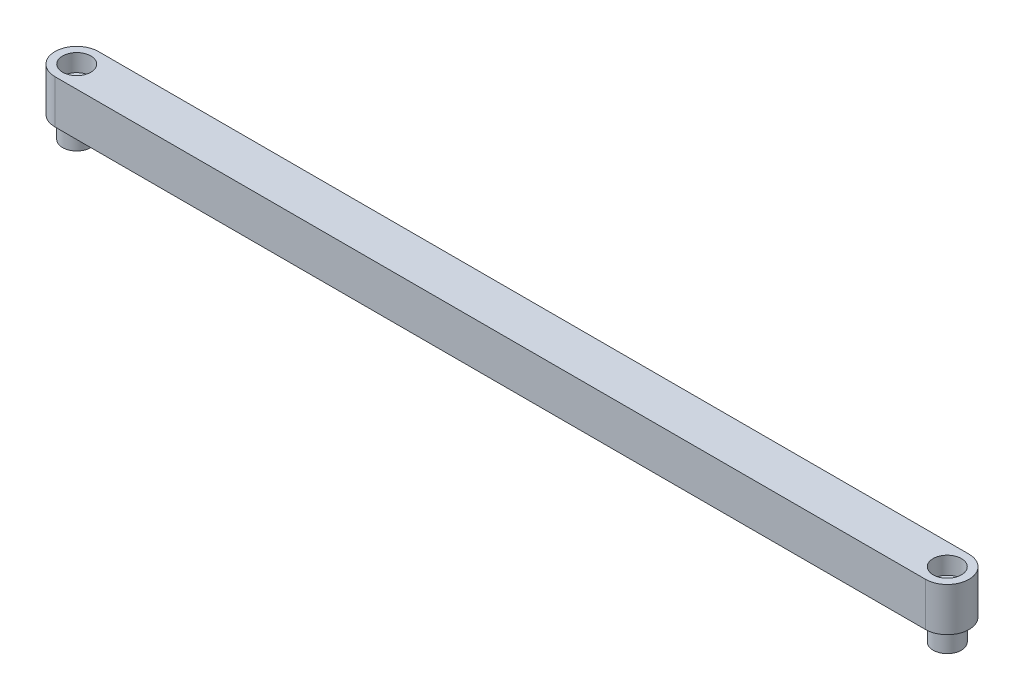
ISO-10303-21;
HEADER;
FILE_DESCRIPTION(('STEP AP214'),'2;1');
FILE_NAME('part.step','',(''),(''),'','','');
FILE_SCHEMA(('AUTOMOTIVE_DESIGN { 1 0 10303 214 1 1 1 1 }'));
ENDSEC;
DATA;
#1=APPLICATION_CONTEXT('core data for automotive mechanical design processes');
#2=APPLICATION_PROTOCOL_DEFINITION('international standard','automotive_design',2000,#1);
#3=PRODUCT_CONTEXT('',#1,'mechanical');
#4=PRODUCT('Part','Part','',(#3));
#5=PRODUCT_RELATED_PRODUCT_CATEGORY('part','',(#4));
#6=PRODUCT_DEFINITION_FORMATION('','',#4);
#7=PRODUCT_DEFINITION_CONTEXT('part definition',#1,'design');
#8=PRODUCT_DEFINITION('design','',#6,#7);
#9=PRODUCT_DEFINITION_SHAPE('','',#8);
#10=(LENGTH_UNIT() NAMED_UNIT(*) SI_UNIT(.MILLI.,.METRE.));
#11=(NAMED_UNIT(*) PLANE_ANGLE_UNIT() SI_UNIT($,.RADIAN.));
#12=(NAMED_UNIT(*) SI_UNIT($,.STERADIAN.) SOLID_ANGLE_UNIT());
#13=UNCERTAINTY_MEASURE_WITH_UNIT(LENGTH_MEASURE(1.E-05),#10,'distance_accuracy_value','');
#14=(GEOMETRIC_REPRESENTATION_CONTEXT(3) GLOBAL_UNCERTAINTY_ASSIGNED_CONTEXT((#13)) GLOBAL_UNIT_ASSIGNED_CONTEXT((#10,
#11,#12)) REPRESENTATION_CONTEXT('',''));
#15=CARTESIAN_POINT('',(0.,0.,0.));
#16=DIRECTION('',(0.,0.,1.));
#17=DIRECTION('',(1.,0.,0.));
#18=AXIS2_PLACEMENT_3D('',#15,#16,#17);
#19=CARTESIAN_POINT('',(0.,15.,0.));
#20=DIRECTION('',(0.,-1.,0.));
#21=DIRECTION('',(0.,0.,-1.));
#22=AXIS2_PLACEMENT_3D('',#19,#20,#21);
#23=CYLINDRICAL_SURFACE('',#22,15.);
#24=CARTESIAN_POINT('',(0.,-15.,0.));
#25=DIRECTION('',(0.,1.,0.));
#26=DIRECTION('',(0.,0.,1.));
#27=AXIS2_PLACEMENT_3D('',#24,#25,#26);
#28=CIRCLE('',#27,15.);
#29=CARTESIAN_POINT('',(0.,-15.,-15.));
#30=VERTEX_POINT('',#29);
#31=CARTESIAN_POINT('',(0.,-15.,15.));
#32=VERTEX_POINT('',#31);
#33=EDGE_CURVE('E104',#30,#32,#28,.T.);
#34=ORIENTED_EDGE('',*,*,#33,.T.);
#35=DIRECTION('',(0.,-1.,0.));
#36=VECTOR('',#35,1.);
#37=CARTESIAN_POINT('',(0.,15.,15.));
#38=LINE('',#37,#36);
#39=CARTESIAN_POINT('',(0.,15.,15.));
#40=VERTEX_POINT('',#39);
#41=EDGE_CURVE('E95',#40,#32,#38,.T.);
#42=ORIENTED_EDGE('',*,*,#41,.F.);
#43=CARTESIAN_POINT('',(0.,15.,0.));
#44=DIRECTION('',(0.,1.,0.));
#45=DIRECTION('',(0.,0.,1.));
#46=AXIS2_PLACEMENT_3D('',#43,#44,#45);
#47=CIRCLE('',#46,15.);
#48=CARTESIAN_POINT('',(0.,15.,-15.));
#49=VERTEX_POINT('',#48);
#50=EDGE_CURVE('E89',#49,#40,#47,.T.);
#51=ORIENTED_EDGE('',*,*,#50,.F.);
#52=DIRECTION('',(0.,-1.,0.));
#53=VECTOR('',#52,1.);
#54=CARTESIAN_POINT('',(0.,15.,-15.));
#55=LINE('',#54,#53);
#56=EDGE_CURVE('E100',#49,#30,#55,.T.);
#57=ORIENTED_EDGE('',*,*,#56,.T.);
#58=EDGE_LOOP('',(#34,#42,#51,#57));
#59=FACE_BOUND('',#58,.T.);
#60=ADVANCED_FACE('F37',(#59),#23,.T.);
#61=CARTESIAN_POINT('',(0.,15.,15.));
#62=DIRECTION('',(0.,0.,-1.));
#63=DIRECTION('',(-1.,0.,0.));
#64=AXIS2_PLACEMENT_3D('',#61,#62,#63);
#65=PLANE('',#64);
#66=DIRECTION('',(1.,0.,0.));
#67=VECTOR('',#66,1.);
#68=CARTESIAN_POINT('',(0.,-15.,15.));
#69=LINE('',#68,#67);
#70=CARTESIAN_POINT('',(600.,-15.,15.));
#71=VERTEX_POINT('',#70);
#72=EDGE_CURVE('E94',#32,#71,#69,.T.);
#73=ORIENTED_EDGE('',*,*,#72,.T.);
#74=DIRECTION('',(0.,-1.,0.));
#75=VECTOR('',#74,1.);
#76=CARTESIAN_POINT('',(600.,15.,15.));
#77=LINE('',#76,#75);
#78=CARTESIAN_POINT('',(600.,15.,15.));
#79=VERTEX_POINT('',#78);
#80=EDGE_CURVE('E92',#79,#71,#77,.T.);
#81=ORIENTED_EDGE('',*,*,#80,.F.);
#82=DIRECTION('',(1.,0.,0.));
#83=VECTOR('',#82,1.);
#84=CARTESIAN_POINT('',(0.,15.,15.));
#85=LINE('',#84,#83);
#86=EDGE_CURVE('E84',#40,#79,#85,.T.);
#87=ORIENTED_EDGE('',*,*,#86,.F.);
#88=ORIENTED_EDGE('',*,*,#41,.T.);
#89=EDGE_LOOP('',(#73,#81,#87,#88));
#90=FACE_BOUND('',#89,.T.);
#91=ADVANCED_FACE('F93',(#90),#65,.F.);
#92=CARTESIAN_POINT('',(600.,15.,0.));
#93=DIRECTION('',(0.,-1.,0.));
#94=DIRECTION('',(0.,0.,-1.));
#95=AXIS2_PLACEMENT_3D('',#92,#93,#94);
#96=CYLINDRICAL_SURFACE('',#95,15.);
#97=CARTESIAN_POINT('',(600.,-15.,0.));
#98=DIRECTION('',(0.,1.,0.));
#99=DIRECTION('',(0.,0.,1.));
#100=AXIS2_PLACEMENT_3D('',#97,#98,#99);
#101=CIRCLE('',#100,15.);
#102=CARTESIAN_POINT('',(600.,-15.,-15.));
#103=VERTEX_POINT('',#102);
#104=EDGE_CURVE('E70',#71,#103,#101,.T.);
#105=ORIENTED_EDGE('',*,*,#104,.T.);
#106=DIRECTION('',(0.,-1.,0.));
#107=VECTOR('',#106,1.);
#108=CARTESIAN_POINT('',(600.,15.,-15.));
#109=LINE('',#108,#107);
#110=CARTESIAN_POINT('',(600.,15.,-15.));
#111=VERTEX_POINT('',#110);
#112=EDGE_CURVE('E96',#111,#103,#109,.T.);
#113=ORIENTED_EDGE('',*,*,#112,.F.);
#114=CARTESIAN_POINT('',(600.,15.,0.));
#115=DIRECTION('',(0.,1.,0.));
#116=DIRECTION('',(0.,0.,1.));
#117=AXIS2_PLACEMENT_3D('',#114,#115,#116);
#118=CIRCLE('',#117,15.);
#119=EDGE_CURVE('E87',#79,#111,#118,.T.);
#120=ORIENTED_EDGE('',*,*,#119,.F.);
#121=ORIENTED_EDGE('',*,*,#80,.T.);
#122=EDGE_LOOP('',(#105,#113,#120,#121));
#123=FACE_BOUND('',#122,.T.);
#124=ADVANCED_FACE('F98',(#123),#96,.T.);
#125=CARTESIAN_POINT('',(0.,15.,-15.));
#126=DIRECTION('',(0.,0.,1.));
#127=DIRECTION('',(1.,0.,0.));
#128=AXIS2_PLACEMENT_3D('',#125,#126,#127);
#129=PLANE('',#128);
#130=DIRECTION('',(-1.,0.,0.));
#131=VECTOR('',#130,1.);
#132=CARTESIAN_POINT('',(0.,-15.,-15.));
#133=LINE('',#132,#131);
#134=EDGE_CURVE('E76',#103,#30,#133,.T.);
#135=ORIENTED_EDGE('',*,*,#134,.T.);
#136=ORIENTED_EDGE('',*,*,#56,.F.);
#137=DIRECTION('',(-1.,0.,0.));
#138=VECTOR('',#137,1.);
#139=CARTESIAN_POINT('',(0.,15.,-15.));
#140=LINE('',#139,#138);
#141=EDGE_CURVE('E53',#111,#49,#140,.T.);
#142=ORIENTED_EDGE('',*,*,#141,.F.);
#143=ORIENTED_EDGE('',*,*,#112,.T.);
#144=EDGE_LOOP('',(#135,#136,#142,#143));
#145=FACE_BOUND('',#144,.T.);
#146=ADVANCED_FACE('F176',(#145),#129,.F.);
#147=CARTESIAN_POINT('',(0.,15.,0.));
#148=DIRECTION('',(0.,1.,0.));
#149=DIRECTION('',(0.,0.,1.));
#150=AXIS2_PLACEMENT_3D('',#147,#148,#149);
#151=PLANE('',#150);
#152=CARTESIAN_POINT('',(0.,15.,0.));
#153=DIRECTION('',(0.,1.,0.));
#154=DIRECTION('',(0.,0.,1.));
#155=AXIS2_PLACEMENT_3D('',#152,#153,#154);
#156=CIRCLE('',#155,9.75);
#157=CARTESIAN_POINT('',(0.,15.,9.75));
#158=VERTEX_POINT('',#157);
#159=EDGE_CURVE('E107',#158,#158,#156,.T.);
#160=ORIENTED_EDGE('',*,*,#159,.F.);
#161=EDGE_LOOP('',(#160));
#162=FACE_BOUND('',#161,.T.);
#163=CARTESIAN_POINT('',(600.,15.,0.));
#164=DIRECTION('',(0.,1.,0.));
#165=DIRECTION('',(0.,0.,1.));
#166=AXIS2_PLACEMENT_3D('',#163,#164,#165);
#167=CIRCLE('',#166,9.75000000000008);
#168=CARTESIAN_POINT('',(600.,15.,9.75000000000008));
#169=VERTEX_POINT('',#168);
#170=EDGE_CURVE('E117',#169,#169,#167,.T.);
#171=ORIENTED_EDGE('',*,*,#170,.F.);
#172=EDGE_LOOP('',(#171));
#173=FACE_BOUND('',#172,.T.);
#174=ORIENTED_EDGE('',*,*,#50,.T.);
#175=ORIENTED_EDGE('',*,*,#86,.T.);
#176=ORIENTED_EDGE('',*,*,#119,.T.);
#177=ORIENTED_EDGE('',*,*,#141,.T.);
#178=EDGE_LOOP('',(#174,#175,#176,#177));
#179=FACE_BOUND('',#178,.T.);
#180=ADVANCED_FACE('F85',(#162,#173,#179),#151,.T.);
#181=CARTESIAN_POINT('',(0.,-15.,0.));
#182=DIRECTION('',(0.,1.,0.));
#183=DIRECTION('',(0.,0.,1.));
#184=AXIS2_PLACEMENT_3D('',#181,#182,#183);
#185=PLANE('',#184);
#186=CARTESIAN_POINT('',(600.,-15.,0.));
#187=DIRECTION('',(0.,1.,0.));
#188=DIRECTION('',(0.,0.,1.));
#189=AXIS2_PLACEMENT_3D('',#186,#187,#188);
#190=CIRCLE('',#189,9.75000000000008);
#191=CARTESIAN_POINT('',(600.,-15.,9.75000000000008));
#192=VERTEX_POINT('',#191);
#193=EDGE_CURVE('E119',#192,#192,#190,.T.);
#194=ORIENTED_EDGE('',*,*,#193,.T.);
#195=EDGE_LOOP('',(#194));
#196=FACE_BOUND('',#195,.T.);
#197=CARTESIAN_POINT('',(0.,-15.,0.));
#198=DIRECTION('',(0.,1.,0.));
#199=DIRECTION('',(0.,0.,1.));
#200=AXIS2_PLACEMENT_3D('',#197,#198,#199);
#201=CIRCLE('',#200,9.75);
#202=CARTESIAN_POINT('',(0.,-15.,9.75));
#203=VERTEX_POINT('',#202);
#204=EDGE_CURVE('E114',#203,#203,#201,.T.);
#205=ORIENTED_EDGE('',*,*,#204,.T.);
#206=EDGE_LOOP('',(#205));
#207=FACE_BOUND('',#206,.T.);
#208=ORIENTED_EDGE('',*,*,#33,.F.);
#209=ORIENTED_EDGE('',*,*,#134,.F.);
#210=ORIENTED_EDGE('',*,*,#104,.F.);
#211=ORIENTED_EDGE('',*,*,#72,.F.);
#212=EDGE_LOOP('',(#208,#209,#210,#211));
#213=FACE_BOUND('',#212,.T.);
#214=ADVANCED_FACE('F166',(#196,#207,#213),#185,.F.);
#215=CARTESIAN_POINT('',(600.,15.,0.));
#216=DIRECTION('',(0.,-1.,0.));
#217=DIRECTION('',(0.,0.,-1.));
#218=AXIS2_PLACEMENT_3D('',#215,#216,#217);
#219=CYLINDRICAL_SURFACE('',#218,9.75000000000008);
#220=CARTESIAN_POINT('',(600.,3.,0.));
#221=DIRECTION('',(0.,1.,0.));
#222=DIRECTION('',(0.,0.,1.));
#223=AXIS2_PLACEMENT_3D('',#220,#221,#222);
#224=CIRCLE('',#223,9.75000000000008);
#225=CARTESIAN_POINT('',(600.,3.,9.75000000000008));
#226=VERTEX_POINT('',#225);
#227=EDGE_CURVE('E11',#226,#226,#224,.T.);
#228=ORIENTED_EDGE('',*,*,#227,.F.);
#229=EDGE_LOOP('',(#228));
#230=FACE_BOUND('',#229,.T.);
#231=ORIENTED_EDGE('',*,*,#170,.T.);
#232=EDGE_LOOP('',(#231));
#233=FACE_BOUND('',#232,.T.);
#234=ADVANCED_FACE('F131',(#230,#233),#219,.F.);
#235=CARTESIAN_POINT('',(0.,15.,0.));
#236=DIRECTION('',(0.,-1.,0.));
#237=DIRECTION('',(0.,0.,-1.));
#238=AXIS2_PLACEMENT_3D('',#235,#236,#237);
#239=CYLINDRICAL_SURFACE('',#238,9.75);
#240=CARTESIAN_POINT('',(0.,3.,0.));
#241=DIRECTION('',(0.,1.,0.));
#242=DIRECTION('',(0.,0.,1.));
#243=AXIS2_PLACEMENT_3D('',#240,#241,#242);
#244=CIRCLE('',#243,9.75);
#245=CARTESIAN_POINT('',(0.,3.,9.75));
#246=VERTEX_POINT('',#245);
#247=EDGE_CURVE('E45',#246,#246,#244,.T.);
#248=ORIENTED_EDGE('',*,*,#247,.F.);
#249=EDGE_LOOP('',(#248));
#250=FACE_BOUND('',#249,.T.);
#251=ORIENTED_EDGE('',*,*,#159,.T.);
#252=EDGE_LOOP('',(#251));
#253=FACE_BOUND('',#252,.T.);
#254=ADVANCED_FACE('F127',(#250,#253),#239,.F.);
#255=CARTESIAN_POINT('',(0.,-30.,0.));
#256=DIRECTION('',(0.,1.,0.));
#257=DIRECTION('',(0.,0.,1.));
#258=AXIS2_PLACEMENT_3D('',#255,#256,#257);
#259=CYLINDRICAL_SURFACE('',#258,9.75);
#260=CARTESIAN_POINT('',(0.,-30.,0.));
#261=DIRECTION('',(0.,1.,0.));
#262=DIRECTION('',(0.,0.,1.));
#263=AXIS2_PLACEMENT_3D('',#260,#261,#262);
#264=CIRCLE('',#263,9.75);
#265=CARTESIAN_POINT('',(0.,-30.,9.75));
#266=VERTEX_POINT('',#265);
#267=EDGE_CURVE('E118',#266,#266,#264,.T.);
#268=ORIENTED_EDGE('',*,*,#267,.T.);
#269=EDGE_LOOP('',(#268));
#270=FACE_BOUND('',#269,.T.);
#271=ORIENTED_EDGE('',*,*,#204,.F.);
#272=EDGE_LOOP('',(#271));
#273=FACE_BOUND('',#272,.T.);
#274=ADVANCED_FACE('F130',(#270,#273),#259,.T.);
#275=CARTESIAN_POINT('',(0.,-30.,0.));
#276=DIRECTION('',(0.,1.,0.));
#277=DIRECTION('',(0.,0.,1.));
#278=AXIS2_PLACEMENT_3D('',#275,#276,#277);
#279=PLANE('',#278);
#280=ORIENTED_EDGE('',*,*,#267,.F.);
#281=EDGE_LOOP('',(#280));
#282=FACE_BOUND('',#281,.T.);
#283=ADVANCED_FACE('F157',(#282),#279,.F.);
#284=CARTESIAN_POINT('',(600.,-30.,0.));
#285=DIRECTION('',(0.,1.,0.));
#286=DIRECTION('',(0.,0.,1.));
#287=AXIS2_PLACEMENT_3D('',#284,#285,#286);
#288=CYLINDRICAL_SURFACE('',#287,9.75000000000008);
#289=CARTESIAN_POINT('',(600.,-30.,0.));
#290=DIRECTION('',(0.,1.,0.));
#291=DIRECTION('',(0.,0.,1.));
#292=AXIS2_PLACEMENT_3D('',#289,#290,#291);
#293=CIRCLE('',#292,9.75000000000008);
#294=CARTESIAN_POINT('',(600.,-30.,9.75000000000008));
#295=VERTEX_POINT('',#294);
#296=EDGE_CURVE('E121',#295,#295,#293,.T.);
#297=ORIENTED_EDGE('',*,*,#296,.T.);
#298=EDGE_LOOP('',(#297));
#299=FACE_BOUND('',#298,.T.);
#300=ORIENTED_EDGE('',*,*,#193,.F.);
#301=EDGE_LOOP('',(#300));
#302=FACE_BOUND('',#301,.T.);
#303=ADVANCED_FACE('F145',(#299,#302),#288,.T.);
#304=CARTESIAN_POINT('',(600.,-30.,0.));
#305=DIRECTION('',(0.,1.,0.));
#306=DIRECTION('',(0.,0.,1.));
#307=AXIS2_PLACEMENT_3D('',#304,#305,#306);
#308=PLANE('',#307);
#309=ORIENTED_EDGE('',*,*,#296,.F.);
#310=EDGE_LOOP('',(#309));
#311=FACE_BOUND('',#310,.T.);
#312=ADVANCED_FACE('F148',(#311),#308,.F.);
#313=CARTESIAN_POINT('',(0.,3.,0.));
#314=DIRECTION('',(0.,1.,0.));
#315=DIRECTION('',(0.,0.,1.));
#316=AXIS2_PLACEMENT_3D('',#313,#314,#315);
#317=PLANE('',#316);
#318=ORIENTED_EDGE('',*,*,#247,.T.);
#319=EDGE_LOOP('',(#318));
#320=FACE_BOUND('',#319,.T.);
#321=ADVANCED_FACE('F125',(#320),#317,.T.);
#322=CARTESIAN_POINT('',(600.,3.,0.));
#323=DIRECTION('',(0.,1.,0.));
#324=DIRECTION('',(0.,0.,1.));
#325=AXIS2_PLACEMENT_3D('',#322,#323,#324);
#326=PLANE('',#325);
#327=ORIENTED_EDGE('',*,*,#227,.T.);
#328=EDGE_LOOP('',(#327));
#329=FACE_BOUND('',#328,.T.);
#330=ADVANCED_FACE('F155',(#329),#326,.T.);
#331=CLOSED_SHELL('',(#60,#91,#124,#146,#180,#214,#234,#254,#274,#283,#303,#312,#321,#330));
#332=MANIFOLD_SOLID_BREP('B2',#331);
#333=ADVANCED_BREP_SHAPE_REPRESENTATION('',(#18,#332),#14);
#334=SHAPE_DEFINITION_REPRESENTATION(#9,#333);
ENDSEC;
END-ISO-10303-21;
